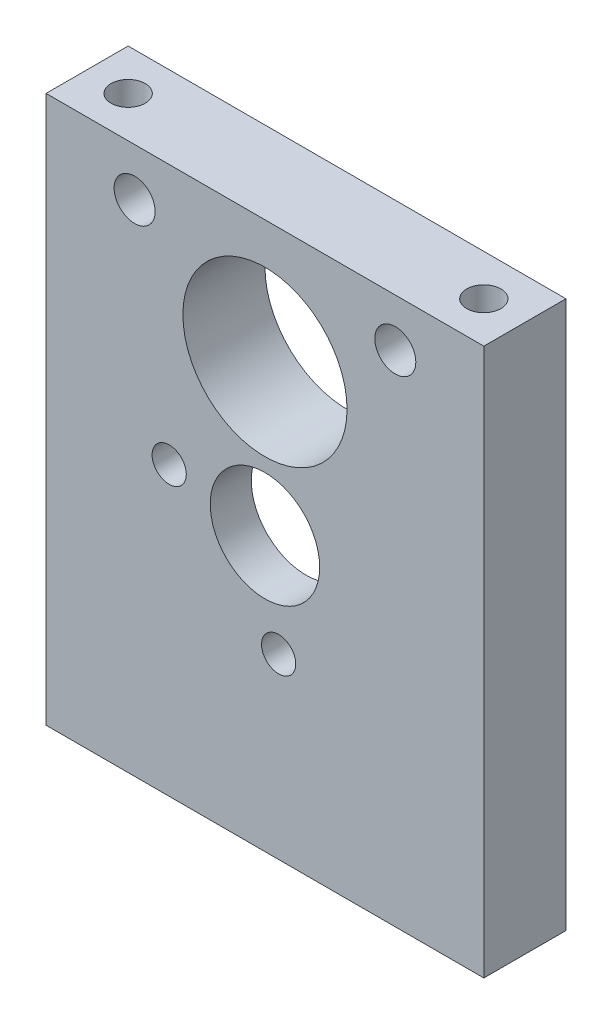
ISO-10303-21;
HEADER;
FILE_DESCRIPTION(('STEP AP214'),'2;1');
FILE_NAME('part.step','',(''),(''),'','','');
FILE_SCHEMA(('AUTOMOTIVE_DESIGN { 1 0 10303 214 1 1 1 1 }'));
ENDSEC;
DATA;
#1=APPLICATION_CONTEXT('core data for automotive mechanical design processes');
#2=APPLICATION_PROTOCOL_DEFINITION('international standard','automotive_design',2000,#1);
#3=PRODUCT_CONTEXT('',#1,'mechanical');
#4=PRODUCT('Part','Part','',(#3));
#5=PRODUCT_RELATED_PRODUCT_CATEGORY('part','',(#4));
#6=PRODUCT_DEFINITION_FORMATION('','',#4);
#7=PRODUCT_DEFINITION_CONTEXT('part definition',#1,'design');
#8=PRODUCT_DEFINITION('design','',#6,#7);
#9=PRODUCT_DEFINITION_SHAPE('','',#8);
#10=(LENGTH_UNIT() NAMED_UNIT(*) SI_UNIT(.MILLI.,.METRE.));
#11=(NAMED_UNIT(*) PLANE_ANGLE_UNIT() SI_UNIT($,.RADIAN.));
#12=(NAMED_UNIT(*) SI_UNIT($,.STERADIAN.) SOLID_ANGLE_UNIT());
#13=UNCERTAINTY_MEASURE_WITH_UNIT(LENGTH_MEASURE(1.E-05),#10,'distance_accuracy_value','');
#14=(GEOMETRIC_REPRESENTATION_CONTEXT(3) GLOBAL_UNCERTAINTY_ASSIGNED_CONTEXT((#13)) GLOBAL_UNIT_ASSIGNED_CONTEXT((#10,
#11,#12)) REPRESENTATION_CONTEXT('',''));
#15=CARTESIAN_POINT('',(0.,0.,0.));
#16=DIRECTION('',(0.,0.,1.));
#17=DIRECTION('',(1.,0.,0.));
#18=AXIS2_PLACEMENT_3D('',#15,#16,#17);
#19=CARTESIAN_POINT('',(-16.,20.,-6.));
#20=DIRECTION('',(-1.,0.,0.));
#21=DIRECTION('',(0.,-1.,0.));
#22=AXIS2_PLACEMENT_3D('',#19,#20,#21);
#23=PLANE('',#22);
#24=DIRECTION('',(0.,-1.,0.));
#25=VECTOR('',#24,1.);
#26=CARTESIAN_POINT('',(-16.,20.,0.));
#27=LINE('',#26,#25);
#28=CARTESIAN_POINT('',(-16.,20.,0.));
#29=VERTEX_POINT('',#28);
#30=CARTESIAN_POINT('',(-16.,-20.,0.));
#31=VERTEX_POINT('',#30);
#32=EDGE_CURVE('E247',#29,#31,#27,.T.);
#33=ORIENTED_EDGE('',*,*,#32,.F.);
#34=DIRECTION('',(0.,0.,1.));
#35=VECTOR('',#34,1.);
#36=CARTESIAN_POINT('',(-16.,20.,-6.));
#37=LINE('',#36,#35);
#38=CARTESIAN_POINT('',(-16.,20.,-6.));
#39=VERTEX_POINT('',#38);
#40=EDGE_CURVE('E11',#39,#29,#37,.T.);
#41=ORIENTED_EDGE('',*,*,#40,.F.);
#42=DIRECTION('',(0.,-1.,0.));
#43=VECTOR('',#42,1.);
#44=CARTESIAN_POINT('',(-16.,20.,-6.));
#45=LINE('',#44,#43);
#46=CARTESIAN_POINT('',(-16.,-20.,-6.));
#47=VERTEX_POINT('',#46);
#48=EDGE_CURVE('E249',#39,#47,#45,.T.);
#49=ORIENTED_EDGE('',*,*,#48,.T.);
#50=DIRECTION('',(0.,0.,1.));
#51=VECTOR('',#50,1.);
#52=CARTESIAN_POINT('',(-16.,-20.,-6.));
#53=LINE('',#52,#51);
#54=EDGE_CURVE('E48',#47,#31,#53,.T.);
#55=ORIENTED_EDGE('',*,*,#54,.T.);
#56=EDGE_LOOP('',(#33,#41,#49,#55));
#57=FACE_BOUND('',#56,.T.);
#58=ADVANCED_FACE('F44',(#57),#23,.T.);
#59=CARTESIAN_POINT('',(-16.,20.,-6.));
#60=DIRECTION('',(0.,1.,0.));
#61=DIRECTION('',(0.,0.,1.));
#62=AXIS2_PLACEMENT_3D('',#59,#60,#61);
#63=PLANE('',#62);
#64=CARTESIAN_POINT('',(13.,20.,-3.));
#65=DIRECTION('',(0.,1.,0.));
#66=DIRECTION('',(-1.,0.,0.));
#67=AXIS2_PLACEMENT_3D('',#64,#65,#66);
#68=CIRCLE('',#67,1.25);
#69=CARTESIAN_POINT('',(11.75,20.,-3.));
#70=VERTEX_POINT('',#69);
#71=EDGE_CURVE('E159',#70,#70,#68,.T.);
#72=ORIENTED_EDGE('',*,*,#71,.F.);
#73=EDGE_LOOP('',(#72));
#74=FACE_BOUND('',#73,.T.);
#75=CARTESIAN_POINT('',(-13.,20.,-3.));
#76=DIRECTION('',(0.,1.,0.));
#77=DIRECTION('',(-1.,0.,0.));
#78=AXIS2_PLACEMENT_3D('',#75,#76,#77);
#79=CIRCLE('',#78,1.25);
#80=CARTESIAN_POINT('',(-14.25,20.,-3.));
#81=VERTEX_POINT('',#80);
#82=EDGE_CURVE('E165',#81,#81,#79,.T.);
#83=ORIENTED_EDGE('',*,*,#82,.F.);
#84=EDGE_LOOP('',(#83));
#85=FACE_BOUND('',#84,.T.);
#86=DIRECTION('',(-1.,0.,0.));
#87=VECTOR('',#86,1.);
#88=CARTESIAN_POINT('',(-16.,20.,0.));
#89=LINE('',#88,#87);
#90=CARTESIAN_POINT('',(16.,20.,0.));
#91=VERTEX_POINT('',#90);
#92=EDGE_CURVE('E252',#91,#29,#89,.T.);
#93=ORIENTED_EDGE('',*,*,#92,.F.);
#94=DIRECTION('',(0.,0.,1.));
#95=VECTOR('',#94,1.);
#96=CARTESIAN_POINT('',(16.,20.,-6.));
#97=LINE('',#96,#95);
#98=CARTESIAN_POINT('',(16.,20.,-6.));
#99=VERTEX_POINT('',#98);
#100=EDGE_CURVE('E52',#99,#91,#97,.T.);
#101=ORIENTED_EDGE('',*,*,#100,.F.);
#102=DIRECTION('',(-1.,0.,0.));
#103=VECTOR('',#102,1.);
#104=CARTESIAN_POINT('',(-16.,20.,-6.));
#105=LINE('',#104,#103);
#106=EDGE_CURVE('E256',#99,#39,#105,.T.);
#107=ORIENTED_EDGE('',*,*,#106,.T.);
#108=ORIENTED_EDGE('',*,*,#40,.T.);
#109=EDGE_LOOP('',(#93,#101,#107,#108));
#110=FACE_BOUND('',#109,.T.);
#111=ADVANCED_FACE('F274',(#74,#85,#110),#63,.T.);
#112=CARTESIAN_POINT('',(16.,20.,-6.));
#113=DIRECTION('',(1.,0.,0.));
#114=DIRECTION('',(0.,1.,0.));
#115=AXIS2_PLACEMENT_3D('',#112,#113,#114);
#116=PLANE('',#115);
#117=DIRECTION('',(0.,1.,0.));
#118=VECTOR('',#117,1.);
#119=CARTESIAN_POINT('',(16.,20.,0.));
#120=LINE('',#119,#118);
#121=CARTESIAN_POINT('',(16.,-20.,0.));
#122=VERTEX_POINT('',#121);
#123=EDGE_CURVE('E261',#122,#91,#120,.T.);
#124=ORIENTED_EDGE('',*,*,#123,.F.);
#125=DIRECTION('',(0.,0.,1.));
#126=VECTOR('',#125,1.);
#127=CARTESIAN_POINT('',(16.,-20.,-6.));
#128=LINE('',#127,#126);
#129=CARTESIAN_POINT('',(16.,-20.,-6.));
#130=VERTEX_POINT('',#129);
#131=EDGE_CURVE('E266',#130,#122,#128,.T.);
#132=ORIENTED_EDGE('',*,*,#131,.F.);
#133=DIRECTION('',(0.,1.,0.));
#134=VECTOR('',#133,1.);
#135=CARTESIAN_POINT('',(16.,20.,-6.));
#136=LINE('',#135,#134);
#137=EDGE_CURVE('E254',#130,#99,#136,.T.);
#138=ORIENTED_EDGE('',*,*,#137,.T.);
#139=ORIENTED_EDGE('',*,*,#100,.T.);
#140=EDGE_LOOP('',(#124,#132,#138,#139));
#141=FACE_BOUND('',#140,.T.);
#142=ADVANCED_FACE('F279',(#141),#116,.T.);
#143=CARTESIAN_POINT('',(-16.,-20.,-6.));
#144=DIRECTION('',(0.,-1.,0.));
#145=DIRECTION('',(0.,0.,-1.));
#146=AXIS2_PLACEMENT_3D('',#143,#144,#145);
#147=PLANE('',#146);
#148=CARTESIAN_POINT('',(13.,-20.,-3.));
#149=DIRECTION('',(0.,-1.,0.));
#150=DIRECTION('',(0.,0.,-1.));
#151=AXIS2_PLACEMENT_3D('',#148,#149,#150);
#152=CIRCLE('',#151,1.25);
#153=CARTESIAN_POINT('',(13.,-20.,-4.25));
#154=VERTEX_POINT('',#153);
#155=EDGE_CURVE('E164',#154,#154,#152,.T.);
#156=ORIENTED_EDGE('',*,*,#155,.F.);
#157=EDGE_LOOP('',(#156));
#158=FACE_BOUND('',#157,.T.);
#159=CARTESIAN_POINT('',(-13.,-20.,-3.));
#160=DIRECTION('',(0.,-1.,0.));
#161=DIRECTION('',(0.,0.,-1.));
#162=AXIS2_PLACEMENT_3D('',#159,#160,#161);
#163=CIRCLE('',#162,1.25);
#164=CARTESIAN_POINT('',(-13.,-20.,-4.25));
#165=VERTEX_POINT('',#164);
#166=EDGE_CURVE('E168',#165,#165,#163,.T.);
#167=ORIENTED_EDGE('',*,*,#166,.F.);
#168=EDGE_LOOP('',(#167));
#169=FACE_BOUND('',#168,.T.);
#170=DIRECTION('',(1.,0.,0.));
#171=VECTOR('',#170,1.);
#172=CARTESIAN_POINT('',(-16.,-20.,0.));
#173=LINE('',#172,#171);
#174=EDGE_CURVE('E265',#31,#122,#173,.T.);
#175=ORIENTED_EDGE('',*,*,#174,.F.);
#176=ORIENTED_EDGE('',*,*,#54,.F.);
#177=DIRECTION('',(1.,0.,0.));
#178=VECTOR('',#177,1.);
#179=CARTESIAN_POINT('',(-16.,-20.,-6.));
#180=LINE('',#179,#178);
#181=EDGE_CURVE('E255',#47,#130,#180,.T.);
#182=ORIENTED_EDGE('',*,*,#181,.T.);
#183=ORIENTED_EDGE('',*,*,#131,.T.);
#184=EDGE_LOOP('',(#175,#176,#182,#183));
#185=FACE_BOUND('',#184,.T.);
#186=ADVANCED_FACE('F272',(#158,#169,#185),#147,.T.);
#187=CARTESIAN_POINT('',(-16.,-20.,-6.));
#188=DIRECTION('',(0.,0.,1.));
#189=DIRECTION('',(1.,0.,0.));
#190=AXIS2_PLACEMENT_3D('',#187,#188,#189);
#191=PLANE('',#190);
#192=CARTESIAN_POINT('',(0.,0.,-6.));
#193=DIRECTION('',(0.,0.,-1.));
#194=DIRECTION('',(-1.,0.,0.));
#195=AXIS2_PLACEMENT_3D('',#192,#193,#194);
#196=CIRCLE('',#195,10.);
#197=CARTESIAN_POINT('',(0.,-10.,-6.));
#198=VERTEX_POINT('',#197);
#199=CARTESIAN_POINT('',(-10.,0.,-6.));
#200=VERTEX_POINT('',#199);
#201=EDGE_CURVE('E207',#198,#200,#196,.T.);
#202=ORIENTED_EDGE('',*,*,#201,.F.);
#203=DIRECTION('',(-1.,0.,0.));
#204=VECTOR('',#203,1.);
#205=CARTESIAN_POINT('',(4.,-10.,-6.));
#206=LINE('',#205,#204);
#207=CARTESIAN_POINT('',(4.,-10.,-6.));
#208=VERTEX_POINT('',#207);
#209=EDGE_CURVE('E62',#208,#198,#206,.T.);
#210=ORIENTED_EDGE('',*,*,#209,.F.);
#211=DIRECTION('',(0.,-1.,0.));
#212=VECTOR('',#211,1.);
#213=CARTESIAN_POINT('',(4.,0.,-6.));
#214=LINE('',#213,#212);
#215=CARTESIAN_POINT('',(4.,0.,-6.));
#216=VERTEX_POINT('',#215);
#217=EDGE_CURVE('E195',#216,#208,#214,.T.);
#218=ORIENTED_EDGE('',*,*,#217,.F.);
#219=CARTESIAN_POINT('',(0.,0.,-6.));
#220=DIRECTION('',(0.,0.,-1.));
#221=DIRECTION('',(-1.,0.,0.));
#222=AXIS2_PLACEMENT_3D('',#219,#220,#221);
#223=CIRCLE('',#222,4.);
#224=CARTESIAN_POINT('',(0.,4.,-6.));
#225=VERTEX_POINT('',#224);
#226=EDGE_CURVE('E214',#225,#216,#223,.T.);
#227=ORIENTED_EDGE('',*,*,#226,.F.);
#228=DIRECTION('',(1.,0.,0.));
#229=VECTOR('',#228,1.);
#230=CARTESIAN_POINT('',(-10.,4.,-6.));
#231=LINE('',#230,#229);
#232=CARTESIAN_POINT('',(-10.,4.,-6.));
#233=VERTEX_POINT('',#232);
#234=EDGE_CURVE('E212',#233,#225,#231,.T.);
#235=ORIENTED_EDGE('',*,*,#234,.F.);
#236=DIRECTION('',(0.,1.,0.));
#237=VECTOR('',#236,1.);
#238=CARTESIAN_POINT('',(-10.,4.,-6.));
#239=LINE('',#238,#237);
#240=EDGE_CURVE('E209',#200,#233,#239,.T.);
#241=ORIENTED_EDGE('',*,*,#240,.F.);
#242=EDGE_LOOP('',(#202,#210,#218,#227,#235,#241));
#243=FACE_BOUND('',#242,.T.);
#244=CARTESIAN_POINT('',(-9.52627944162887,16.4999999999999,-6.));
#245=DIRECTION('',(0.,0.,-1.));
#246=DIRECTION('',(0.499999999999992,0.866025403784443,0.));
#247=AXIS2_PLACEMENT_3D('',#244,#245,#246);
#248=CIRCLE('',#247,1.5);
#249=CARTESIAN_POINT('',(-8.77627944162888,17.7990381056766,-6.));
#250=VERTEX_POINT('',#249);
#251=EDGE_CURVE('E225',#250,#250,#248,.T.);
#252=ORIENTED_EDGE('',*,*,#251,.F.);
#253=EDGE_LOOP('',(#252));
#254=FACE_BOUND('',#253,.T.);
#255=CARTESIAN_POINT('',(9.5262794416288,16.5,-6.));
#256=DIRECTION('',(0.,0.,-1.));
#257=DIRECTION('',(0.500000000000004,-0.866025403784436,0.));
#258=AXIS2_PLACEMENT_3D('',#255,#256,#257);
#259=CIRCLE('',#258,1.5);
#260=CARTESIAN_POINT('',(10.2762794416288,15.2009618943234,-6.));
#261=VERTEX_POINT('',#260);
#262=EDGE_CURVE('E240',#261,#261,#259,.T.);
#263=ORIENTED_EDGE('',*,*,#262,.F.);
#264=EDGE_LOOP('',(#263));
#265=FACE_BOUND('',#264,.T.);
#266=CARTESIAN_POINT('',(0.,11.,-6.));
#267=DIRECTION('',(0.,0.,-1.));
#268=DIRECTION('',(-1.,0.,0.));
#269=AXIS2_PLACEMENT_3D('',#266,#267,#268);
#270=CIRCLE('',#269,6.);
#271=CARTESIAN_POINT('',(-6.,11.,-6.));
#272=VERTEX_POINT('',#271);
#273=EDGE_CURVE('E244',#272,#272,#270,.T.);
#274=ORIENTED_EDGE('',*,*,#273,.F.);
#275=EDGE_LOOP('',(#274));
#276=FACE_BOUND('',#275,.T.);
#277=ORIENTED_EDGE('',*,*,#48,.F.);
#278=ORIENTED_EDGE('',*,*,#106,.F.);
#279=ORIENTED_EDGE('',*,*,#137,.F.);
#280=ORIENTED_EDGE('',*,*,#181,.F.);
#281=EDGE_LOOP('',(#277,#278,#279,#280));
#282=FACE_BOUND('',#281,.T.);
#283=ADVANCED_FACE('F281',(#243,#254,#265,#276,#282),#191,.F.);
#284=CARTESIAN_POINT('',(-16.,-20.,0.));
#285=DIRECTION('',(0.,0.,1.));
#286=DIRECTION('',(1.,0.,0.));
#287=AXIS2_PLACEMENT_3D('',#284,#285,#286);
#288=PLANE('',#287);
#289=CARTESIAN_POINT('',(-7.,1.,0.));
#290=DIRECTION('',(0.,0.,1.));
#291=DIRECTION('',(1.,0.,0.));
#292=AXIS2_PLACEMENT_3D('',#289,#290,#291);
#293=CIRCLE('',#292,1.25);
#294=CARTESIAN_POINT('',(-5.75,1.,0.));
#295=VERTEX_POINT('',#294);
#296=EDGE_CURVE('E173',#295,#295,#293,.F.);
#297=ORIENTED_EDGE('',*,*,#296,.T.);
#298=EDGE_LOOP('',(#297));
#299=FACE_BOUND('',#298,.T.);
#300=CARTESIAN_POINT('',(0.999999999999996,-7.,0.));
#301=DIRECTION('',(0.,0.,1.));
#302=DIRECTION('',(1.,0.,0.));
#303=AXIS2_PLACEMENT_3D('',#300,#301,#302);
#304=CIRCLE('',#303,1.25);
#305=CARTESIAN_POINT('',(2.25,-7.,0.));
#306=VERTEX_POINT('',#305);
#307=EDGE_CURVE('E178',#306,#306,#304,.F.);
#308=ORIENTED_EDGE('',*,*,#307,.T.);
#309=EDGE_LOOP('',(#308));
#310=FACE_BOUND('',#309,.T.);
#311=CARTESIAN_POINT('',(0.,0.,0.));
#312=DIRECTION('',(0.,0.,1.));
#313=DIRECTION('',(1.,0.,0.));
#314=AXIS2_PLACEMENT_3D('',#311,#312,#313);
#315=CIRCLE('',#314,4.);
#316=CARTESIAN_POINT('',(4.,0.,0.));
#317=VERTEX_POINT('',#316);
#318=EDGE_CURVE('E183',#317,#317,#315,.F.);
#319=ORIENTED_EDGE('',*,*,#318,.T.);
#320=EDGE_LOOP('',(#319));
#321=FACE_BOUND('',#320,.T.);
#322=CARTESIAN_POINT('',(-9.52627944162887,16.4999999999999,0.));
#323=DIRECTION('',(0.,0.,1.));
#324=DIRECTION('',(1.,0.,0.));
#325=AXIS2_PLACEMENT_3D('',#322,#323,#324);
#326=CIRCLE('',#325,1.5);
#327=CARTESIAN_POINT('',(-8.02627944162887,16.4999999999999,0.));
#328=VERTEX_POINT('',#327);
#329=EDGE_CURVE('E233',#328,#328,#326,.F.);
#330=ORIENTED_EDGE('',*,*,#329,.T.);
#331=EDGE_LOOP('',(#330));
#332=FACE_BOUND('',#331,.T.);
#333=CARTESIAN_POINT('',(9.5262794416288,16.5,0.));
#334=DIRECTION('',(0.,0.,1.));
#335=DIRECTION('',(1.,0.,0.));
#336=AXIS2_PLACEMENT_3D('',#333,#334,#335);
#337=CIRCLE('',#336,1.5);
#338=CARTESIAN_POINT('',(11.0262794416288,16.5,0.));
#339=VERTEX_POINT('',#338);
#340=EDGE_CURVE('E238',#339,#339,#337,.F.);
#341=ORIENTED_EDGE('',*,*,#340,.T.);
#342=EDGE_LOOP('',(#341));
#343=FACE_BOUND('',#342,.T.);
#344=CARTESIAN_POINT('',(0.,11.,0.));
#345=DIRECTION('',(0.,0.,1.));
#346=DIRECTION('',(1.,0.,0.));
#347=AXIS2_PLACEMENT_3D('',#344,#345,#346);
#348=CIRCLE('',#347,6.);
#349=CARTESIAN_POINT('',(6.,11.,0.));
#350=VERTEX_POINT('',#349);
#351=EDGE_CURVE('E246',#350,#350,#348,.F.);
#352=ORIENTED_EDGE('',*,*,#351,.T.);
#353=EDGE_LOOP('',(#352));
#354=FACE_BOUND('',#353,.T.);
#355=ORIENTED_EDGE('',*,*,#32,.T.);
#356=ORIENTED_EDGE('',*,*,#174,.T.);
#357=ORIENTED_EDGE('',*,*,#123,.T.);
#358=ORIENTED_EDGE('',*,*,#92,.T.);
#359=EDGE_LOOP('',(#355,#356,#357,#358));
#360=FACE_BOUND('',#359,.T.);
#361=ADVANCED_FACE('F275',(#299,#310,#321,#332,#343,#354,#360),#288,.T.);
#362=CARTESIAN_POINT('',(0.,11.,16.9705627484771));
#363=DIRECTION('',(0.,0.,-1.));
#364=DIRECTION('',(-1.,0.,0.));
#365=AXIS2_PLACEMENT_3D('',#362,#363,#364);
#366=CYLINDRICAL_SURFACE('',#365,6.);
#367=ORIENTED_EDGE('',*,*,#273,.T.);
#368=EDGE_LOOP('',(#367));
#369=FACE_BOUND('',#368,.T.);
#370=ORIENTED_EDGE('',*,*,#351,.F.);
#371=EDGE_LOOP('',(#370));
#372=FACE_BOUND('',#371,.T.);
#373=ADVANCED_FACE('F287',(#369,#372),#366,.F.);
#374=CARTESIAN_POINT('',(9.5262794416288,16.5,4.2426406871193));
#375=DIRECTION('',(0.,0.,-1.));
#376=DIRECTION('',(-1.,0.,0.));
#377=AXIS2_PLACEMENT_3D('',#374,#375,#376);
#378=CYLINDRICAL_SURFACE('',#377,1.5);
#379=ORIENTED_EDGE('',*,*,#262,.T.);
#380=EDGE_LOOP('',(#379));
#381=FACE_BOUND('',#380,.T.);
#382=ORIENTED_EDGE('',*,*,#340,.F.);
#383=EDGE_LOOP('',(#382));
#384=FACE_BOUND('',#383,.T.);
#385=ADVANCED_FACE('F367',(#381,#384),#378,.F.);
#386=CARTESIAN_POINT('',(-9.52627944162887,16.4999999999999,4.2426406871193));
#387=DIRECTION('',(0.,0.,-1.));
#388=DIRECTION('',(-1.,0.,0.));
#389=AXIS2_PLACEMENT_3D('',#386,#387,#388);
#390=CYLINDRICAL_SURFACE('',#389,1.5);
#391=ORIENTED_EDGE('',*,*,#251,.T.);
#392=EDGE_LOOP('',(#391));
#393=FACE_BOUND('',#392,.T.);
#394=ORIENTED_EDGE('',*,*,#329,.F.);
#395=EDGE_LOOP('',(#394));
#396=FACE_BOUND('',#395,.T.);
#397=ADVANCED_FACE('F342',(#393,#396),#390,.F.);
#398=CARTESIAN_POINT('',(0.,0.,-3.));
#399=DIRECTION('',(0.,0.,-1.));
#400=DIRECTION('',(-1.,0.,0.));
#401=AXIS2_PLACEMENT_3D('',#398,#399,#400);
#402=PLANE('',#401);
#403=CARTESIAN_POINT('',(-7.,1.,-3.));
#404=DIRECTION('',(0.,0.,-1.));
#405=DIRECTION('',(-1.,0.,0.));
#406=AXIS2_PLACEMENT_3D('',#403,#404,#405);
#407=CIRCLE('',#406,1.25);
#408=CARTESIAN_POINT('',(-8.25,1.,-3.));
#409=VERTEX_POINT('',#408);
#410=EDGE_CURVE('E171',#409,#409,#407,.T.);
#411=ORIENTED_EDGE('',*,*,#410,.F.);
#412=EDGE_LOOP('',(#411));
#413=FACE_BOUND('',#412,.T.);
#414=CARTESIAN_POINT('',(0.999999999999996,-7.,-3.));
#415=DIRECTION('',(0.,0.,-1.));
#416=DIRECTION('',(-1.,0.,0.));
#417=AXIS2_PLACEMENT_3D('',#414,#415,#416);
#418=CIRCLE('',#417,1.25);
#419=CARTESIAN_POINT('',(-0.250000000000005,-7.,-3.));
#420=VERTEX_POINT('',#419);
#421=EDGE_CURVE('E180',#420,#420,#418,.T.);
#422=ORIENTED_EDGE('',*,*,#421,.F.);
#423=EDGE_LOOP('',(#422));
#424=FACE_BOUND('',#423,.T.);
#425=CARTESIAN_POINT('',(0.,0.,-3.));
#426=DIRECTION('',(0.,0.,-1.));
#427=DIRECTION('',(-1.,0.,0.));
#428=AXIS2_PLACEMENT_3D('',#425,#426,#427);
#429=CIRCLE('',#428,4.);
#430=CARTESIAN_POINT('',(4.,0.,-3.));
#431=VERTEX_POINT('',#430);
#432=CARTESIAN_POINT('',(0.,4.,-3.));
#433=VERTEX_POINT('',#432);
#434=EDGE_CURVE('E184',#431,#433,#429,.T.);
#435=ORIENTED_EDGE('',*,*,#434,.F.);
#436=DIRECTION('',(0.,-1.,0.));
#437=VECTOR('',#436,1.);
#438=CARTESIAN_POINT('',(4.,0.,-3.));
#439=LINE('',#438,#437);
#440=CARTESIAN_POINT('',(4.,-10.,-3.));
#441=VERTEX_POINT('',#440);
#442=EDGE_CURVE('E202',#431,#441,#439,.T.);
#443=ORIENTED_EDGE('',*,*,#442,.T.);
#444=DIRECTION('',(-1.,0.,0.));
#445=VECTOR('',#444,1.);
#446=CARTESIAN_POINT('',(4.,-10.,-3.));
#447=LINE('',#446,#445);
#448=CARTESIAN_POINT('',(0.,-10.,-3.));
#449=VERTEX_POINT('',#448);
#450=EDGE_CURVE('E188',#441,#449,#447,.T.);
#451=ORIENTED_EDGE('',*,*,#450,.T.);
#452=CARTESIAN_POINT('',(0.,0.,-3.));
#453=DIRECTION('',(0.,0.,-1.));
#454=DIRECTION('',(-1.,0.,0.));
#455=AXIS2_PLACEMENT_3D('',#452,#453,#454);
#456=CIRCLE('',#455,10.);
#457=CARTESIAN_POINT('',(-10.,0.,-3.));
#458=VERTEX_POINT('',#457);
#459=EDGE_CURVE('E191',#449,#458,#456,.T.);
#460=ORIENTED_EDGE('',*,*,#459,.T.);
#461=DIRECTION('',(0.,1.,0.));
#462=VECTOR('',#461,1.);
#463=CARTESIAN_POINT('',(-10.,4.,-3.));
#464=LINE('',#463,#462);
#465=CARTESIAN_POINT('',(-10.,4.,-3.));
#466=VERTEX_POINT('',#465);
#467=EDGE_CURVE('E194',#458,#466,#464,.T.);
#468=ORIENTED_EDGE('',*,*,#467,.T.);
#469=DIRECTION('',(1.,0.,0.));
#470=VECTOR('',#469,1.);
#471=CARTESIAN_POINT('',(-10.,4.,-3.));
#472=LINE('',#471,#470);
#473=EDGE_CURVE('E196',#466,#433,#472,.T.);
#474=ORIENTED_EDGE('',*,*,#473,.T.);
#475=EDGE_LOOP('',(#435,#443,#451,#460,#468,#474));
#476=FACE_BOUND('',#475,.T.);
#477=ADVANCED_FACE('F337',(#413,#424,#476),#402,.T.);
#478=CARTESIAN_POINT('',(4.,-10.,-3.));
#479=DIRECTION('',(0.,-1.,0.));
#480=DIRECTION('',(0.,0.,-1.));
#481=AXIS2_PLACEMENT_3D('',#478,#479,#480);
#482=PLANE('',#481);
#483=ORIENTED_EDGE('',*,*,#209,.T.);
#484=DIRECTION('',(0.,0.,-1.));
#485=VECTOR('',#484,1.);
#486=CARTESIAN_POINT('',(0.,-10.,-3.));
#487=LINE('',#486,#485);
#488=EDGE_CURVE('E204',#449,#198,#487,.T.);
#489=ORIENTED_EDGE('',*,*,#488,.F.);
#490=ORIENTED_EDGE('',*,*,#450,.F.);
#491=DIRECTION('',(0.,0.,-1.));
#492=VECTOR('',#491,1.);
#493=CARTESIAN_POINT('',(4.,-10.,-3.));
#494=LINE('',#493,#492);
#495=EDGE_CURVE('E217',#441,#208,#494,.T.);
#496=ORIENTED_EDGE('',*,*,#495,.T.);
#497=EDGE_LOOP('',(#483,#489,#490,#496));
#498=FACE_BOUND('',#497,.T.);
#499=ADVANCED_FACE('F343',(#498),#482,.F.);
#500=CARTESIAN_POINT('',(4.,0.,-3.));
#501=DIRECTION('',(1.,0.,0.));
#502=DIRECTION('',(0.,1.,0.));
#503=AXIS2_PLACEMENT_3D('',#500,#501,#502);
#504=PLANE('',#503);
#505=ORIENTED_EDGE('',*,*,#217,.T.);
#506=ORIENTED_EDGE('',*,*,#495,.F.);
#507=ORIENTED_EDGE('',*,*,#442,.F.);
#508=DIRECTION('',(0.,0.,-1.));
#509=VECTOR('',#508,1.);
#510=CARTESIAN_POINT('',(4.,0.,-3.));
#511=LINE('',#510,#509);
#512=EDGE_CURVE('E223',#431,#216,#511,.T.);
#513=ORIENTED_EDGE('',*,*,#512,.T.);
#514=EDGE_LOOP('',(#505,#506,#507,#513));
#515=FACE_BOUND('',#514,.T.);
#516=ADVANCED_FACE('F346',(#515),#504,.F.);
#517=CARTESIAN_POINT('',(0.,0.,-3.));
#518=DIRECTION('',(0.,0.,-1.));
#519=DIRECTION('',(-1.,0.,0.));
#520=AXIS2_PLACEMENT_3D('',#517,#518,#519);
#521=CYLINDRICAL_SURFACE('',#520,4.);
#522=ORIENTED_EDGE('',*,*,#226,.T.);
#523=ORIENTED_EDGE('',*,*,#512,.F.);
#524=ORIENTED_EDGE('',*,*,#434,.T.);
#525=DIRECTION('',(0.,0.,-1.));
#526=VECTOR('',#525,1.);
#527=CARTESIAN_POINT('',(0.,4.,-3.));
#528=LINE('',#527,#526);
#529=EDGE_CURVE('E224',#433,#225,#528,.T.);
#530=ORIENTED_EDGE('',*,*,#529,.T.);
#531=EDGE_LOOP('',(#522,#523,#524,#530));
#532=FACE_BOUND('',#531,.T.);
#533=ORIENTED_EDGE('',*,*,#318,.F.);
#534=EDGE_LOOP('',(#533));
#535=FACE_BOUND('',#534,.T.);
#536=ADVANCED_FACE('F347',(#532,#535),#521,.F.);
#537=CARTESIAN_POINT('',(-10.,4.,-3.));
#538=DIRECTION('',(0.,1.,0.));
#539=DIRECTION('',(-1.,0.,0.));
#540=AXIS2_PLACEMENT_3D('',#537,#538,#539);
#541=PLANE('',#540);
#542=ORIENTED_EDGE('',*,*,#234,.T.);
#543=ORIENTED_EDGE('',*,*,#529,.F.);
#544=ORIENTED_EDGE('',*,*,#473,.F.);
#545=DIRECTION('',(0.,0.,-1.));
#546=VECTOR('',#545,1.);
#547=CARTESIAN_POINT('',(-10.,4.,-3.));
#548=LINE('',#547,#546);
#549=EDGE_CURVE('E230',#466,#233,#548,.T.);
#550=ORIENTED_EDGE('',*,*,#549,.T.);
#551=EDGE_LOOP('',(#542,#543,#544,#550));
#552=FACE_BOUND('',#551,.T.);
#553=ADVANCED_FACE('F352',(#552),#541,.F.);
#554=CARTESIAN_POINT('',(-10.,4.,-3.));
#555=DIRECTION('',(-1.,0.,0.));
#556=DIRECTION('',(0.,0.,1.));
#557=AXIS2_PLACEMENT_3D('',#554,#555,#556);
#558=PLANE('',#557);
#559=ORIENTED_EDGE('',*,*,#240,.T.);
#560=ORIENTED_EDGE('',*,*,#549,.F.);
#561=ORIENTED_EDGE('',*,*,#467,.F.);
#562=DIRECTION('',(0.,0.,-1.));
#563=VECTOR('',#562,1.);
#564=CARTESIAN_POINT('',(-10.,0.,-3.));
#565=LINE('',#564,#563);
#566=EDGE_CURVE('E227',#458,#200,#565,.T.);
#567=ORIENTED_EDGE('',*,*,#566,.T.);
#568=EDGE_LOOP('',(#559,#560,#561,#567));
#569=FACE_BOUND('',#568,.T.);
#570=ADVANCED_FACE('F360',(#569),#558,.F.);
#571=CARTESIAN_POINT('',(0.,0.,-3.));
#572=DIRECTION('',(0.,0.,-1.));
#573=DIRECTION('',(-1.,0.,0.));
#574=AXIS2_PLACEMENT_3D('',#571,#572,#573);
#575=CYLINDRICAL_SURFACE('',#574,10.);
#576=ORIENTED_EDGE('',*,*,#201,.T.);
#577=ORIENTED_EDGE('',*,*,#566,.F.);
#578=ORIENTED_EDGE('',*,*,#459,.F.);
#579=ORIENTED_EDGE('',*,*,#488,.T.);
#580=EDGE_LOOP('',(#576,#577,#578,#579));
#581=FACE_BOUND('',#580,.T.);
#582=ADVANCED_FACE('F336',(#581),#575,.F.);
#583=CARTESIAN_POINT('',(0.999999999999996,-7.,3.53553390593274));
#584=DIRECTION('',(0.,0.,-1.));
#585=DIRECTION('',(-1.,0.,0.));
#586=AXIS2_PLACEMENT_3D('',#583,#584,#585);
#587=CYLINDRICAL_SURFACE('',#586,1.25);
#588=ORIENTED_EDGE('',*,*,#421,.T.);
#589=EDGE_LOOP('',(#588));
#590=FACE_BOUND('',#589,.T.);
#591=ORIENTED_EDGE('',*,*,#307,.F.);
#592=EDGE_LOOP('',(#591));
#593=FACE_BOUND('',#592,.T.);
#594=ADVANCED_FACE('F335',(#590,#593),#587,.F.);
#595=CARTESIAN_POINT('',(-7.,1.,3.53553390593274));
#596=DIRECTION('',(0.,0.,-1.));
#597=DIRECTION('',(-1.,0.,0.));
#598=AXIS2_PLACEMENT_3D('',#595,#596,#597);
#599=CYLINDRICAL_SURFACE('',#598,1.25);
#600=ORIENTED_EDGE('',*,*,#410,.T.);
#601=EDGE_LOOP('',(#600));
#602=FACE_BOUND('',#601,.T.);
#603=ORIENTED_EDGE('',*,*,#296,.F.);
#604=EDGE_LOOP('',(#603));
#605=FACE_BOUND('',#604,.T.);
#606=ADVANCED_FACE('F326',(#602,#605),#599,.F.);
#607=CARTESIAN_POINT('',(-13.,-10.,-3.));
#608=DIRECTION('',(0.,-1.,0.));
#609=DIRECTION('',(0.,0.,-1.));
#610=AXIS2_PLACEMENT_3D('',#607,#608,#609);
#611=CYLINDRICAL_SURFACE('',#610,1.25);
#612=CARTESIAN_POINT('',(-13.,-10.,-3.));
#613=DIRECTION('',(0.,-1.,0.));
#614=DIRECTION('',(0.,0.,-1.));
#615=AXIS2_PLACEMENT_3D('',#612,#613,#614);
#616=CIRCLE('',#615,1.24999999999999);
#617=CARTESIAN_POINT('',(-13.,-10.,-4.24999999999999));
#618=VERTEX_POINT('',#617);
#619=EDGE_CURVE('E153',#618,#618,#616,.T.);
#620=ORIENTED_EDGE('',*,*,#619,.F.);
#621=EDGE_LOOP('',(#620));
#622=FACE_BOUND('',#621,.T.);
#623=ORIENTED_EDGE('',*,*,#166,.T.);
#624=EDGE_LOOP('',(#623));
#625=FACE_BOUND('',#624,.T.);
#626=ADVANCED_FACE('F325',(#622,#625),#611,.F.);
#627=CARTESIAN_POINT('',(13.,-10.,-3.));
#628=DIRECTION('',(0.,-1.,0.));
#629=DIRECTION('',(0.,0.,-1.));
#630=AXIS2_PLACEMENT_3D('',#627,#628,#629);
#631=CYLINDRICAL_SURFACE('',#630,1.25);
#632=CARTESIAN_POINT('',(13.,-10.,-3.));
#633=DIRECTION('',(0.,-1.,0.));
#634=DIRECTION('',(0.,0.,-1.));
#635=AXIS2_PLACEMENT_3D('',#632,#633,#634);
#636=CIRCLE('',#635,1.24999999999999);
#637=CARTESIAN_POINT('',(13.,-10.,-4.24999999999999));
#638=VERTEX_POINT('',#637);
#639=EDGE_CURVE('E158',#638,#638,#636,.T.);
#640=ORIENTED_EDGE('',*,*,#639,.F.);
#641=EDGE_LOOP('',(#640));
#642=FACE_BOUND('',#641,.T.);
#643=ORIENTED_EDGE('',*,*,#155,.T.);
#644=EDGE_LOOP('',(#643));
#645=FACE_BOUND('',#644,.T.);
#646=ADVANCED_FACE('F312',(#642,#645),#631,.F.);
#647=CARTESIAN_POINT('',(-13.,10.,-3.));
#648=DIRECTION('',(0.,1.,0.));
#649=DIRECTION('',(-1.,0.,0.));
#650=AXIS2_PLACEMENT_3D('',#647,#648,#649);
#651=CYLINDRICAL_SURFACE('',#650,1.25);
#652=CARTESIAN_POINT('',(-13.,10.,-3.));
#653=DIRECTION('',(0.,1.,0.));
#654=DIRECTION('',(0.,0.,1.));
#655=AXIS2_PLACEMENT_3D('',#652,#653,#654);
#656=CIRCLE('',#655,1.24999999999999);
#657=CARTESIAN_POINT('',(-13.,10.,-1.75000000000001));
#658=VERTEX_POINT('',#657);
#659=EDGE_CURVE('E148',#658,#658,#656,.T.);
#660=ORIENTED_EDGE('',*,*,#659,.F.);
#661=EDGE_LOOP('',(#660));
#662=FACE_BOUND('',#661,.T.);
#663=ORIENTED_EDGE('',*,*,#82,.T.);
#664=EDGE_LOOP('',(#663));
#665=FACE_BOUND('',#664,.T.);
#666=ADVANCED_FACE('F309',(#662,#665),#651,.F.);
#667=CARTESIAN_POINT('',(13.,10.,-3.));
#668=DIRECTION('',(0.,1.,0.));
#669=DIRECTION('',(-1.,0.,0.));
#670=AXIS2_PLACEMENT_3D('',#667,#668,#669);
#671=CYLINDRICAL_SURFACE('',#670,1.25);
#672=CARTESIAN_POINT('',(13.,10.,-3.));
#673=DIRECTION('',(0.,1.,0.));
#674=DIRECTION('',(0.,0.,1.));
#675=AXIS2_PLACEMENT_3D('',#672,#673,#674);
#676=CIRCLE('',#675,1.24999999999999);
#677=CARTESIAN_POINT('',(13.,10.,-1.75000000000001));
#678=VERTEX_POINT('',#677);
#679=EDGE_CURVE('E147',#678,#678,#676,.T.);
#680=ORIENTED_EDGE('',*,*,#679,.F.);
#681=EDGE_LOOP('',(#680));
#682=FACE_BOUND('',#681,.T.);
#683=ORIENTED_EDGE('',*,*,#71,.T.);
#684=EDGE_LOOP('',(#683));
#685=FACE_BOUND('',#684,.T.);
#686=ADVANCED_FACE('F315',(#682,#685),#671,.F.);
#687=CARTESIAN_POINT('',(13.,-10.,-3.));
#688=DIRECTION('',(0.,-1.,0.));
#689=DIRECTION('',(0.,0.,-1.));
#690=AXIS2_PLACEMENT_3D('',#687,#688,#689);
#691=CONICAL_SURFACE('',#690,1.24999999999999,1.02974425867664);
#692=CARTESIAN_POINT('',(13.,-9.24892422621555,-3.));
#693=VERTEX_POINT('',#692);
#694=VERTEX_LOOP('',#693);
#695=FACE_BOUND('',#694,.T.);
#696=ORIENTED_EDGE('',*,*,#639,.T.);
#697=EDGE_LOOP('',(#696));
#698=FACE_BOUND('',#697,.T.);
#699=ADVANCED_FACE('F318',(#695,#698),#691,.F.);
#700=CARTESIAN_POINT('',(-13.,-10.,-3.));
#701=DIRECTION('',(0.,-1.,0.));
#702=DIRECTION('',(0.,0.,-1.));
#703=AXIS2_PLACEMENT_3D('',#700,#701,#702);
#704=CONICAL_SURFACE('',#703,1.24999999999999,1.02974425867664);
#705=CARTESIAN_POINT('',(-13.,-9.24892422621555,-3.));
#706=VERTEX_POINT('',#705);
#707=VERTEX_LOOP('',#706);
#708=FACE_BOUND('',#707,.T.);
#709=ORIENTED_EDGE('',*,*,#619,.T.);
#710=EDGE_LOOP('',(#709));
#711=FACE_BOUND('',#710,.T.);
#712=ADVANCED_FACE('F466',(#708,#711),#704,.F.);
#713=CARTESIAN_POINT('',(-13.,10.,-3.));
#714=DIRECTION('',(0.,1.,0.));
#715=DIRECTION('',(0.,0.,1.));
#716=AXIS2_PLACEMENT_3D('',#713,#714,#715);
#717=CONICAL_SURFACE('',#716,1.24999999999999,1.02974425867664);
#718=CARTESIAN_POINT('',(-13.,9.24892422621555,-3.));
#719=VERTEX_POINT('',#718);
#720=VERTEX_LOOP('',#719);
#721=FACE_BOUND('',#720,.T.);
#722=ORIENTED_EDGE('',*,*,#659,.T.);
#723=EDGE_LOOP('',(#722));
#724=FACE_BOUND('',#723,.T.);
#725=ADVANCED_FACE('F145',(#721,#724),#717,.F.);
#726=CARTESIAN_POINT('',(13.,10.,-3.));
#727=DIRECTION('',(0.,1.,0.));
#728=DIRECTION('',(0.,0.,1.));
#729=AXIS2_PLACEMENT_3D('',#726,#727,#728);
#730=CONICAL_SURFACE('',#729,1.24999999999999,1.02974425867664);
#731=CARTESIAN_POINT('',(13.,9.24892422621555,-3.));
#732=VERTEX_POINT('',#731);
#733=VERTEX_LOOP('',#732);
#734=FACE_BOUND('',#733,.T.);
#735=ORIENTED_EDGE('',*,*,#679,.T.);
#736=EDGE_LOOP('',(#735));
#737=FACE_BOUND('',#736,.T.);
#738=ADVANCED_FACE('F139',(#734,#737),#730,.F.);
#739=CLOSED_SHELL('',(#58,#111,#142,#186,#283,#361,#373,#385,#397,#477,#499,#516,#536,#553,#570,
#582,#594,#606,#626,#646,#666,#686,#699,#712,#725,#738));
#740=MANIFOLD_SOLID_BREP('B2',#739);
#741=ADVANCED_BREP_SHAPE_REPRESENTATION('',(#18,#740),#14);
#742=SHAPE_DEFINITION_REPRESENTATION(#9,#741);
ENDSEC;
END-ISO-10303-21;
